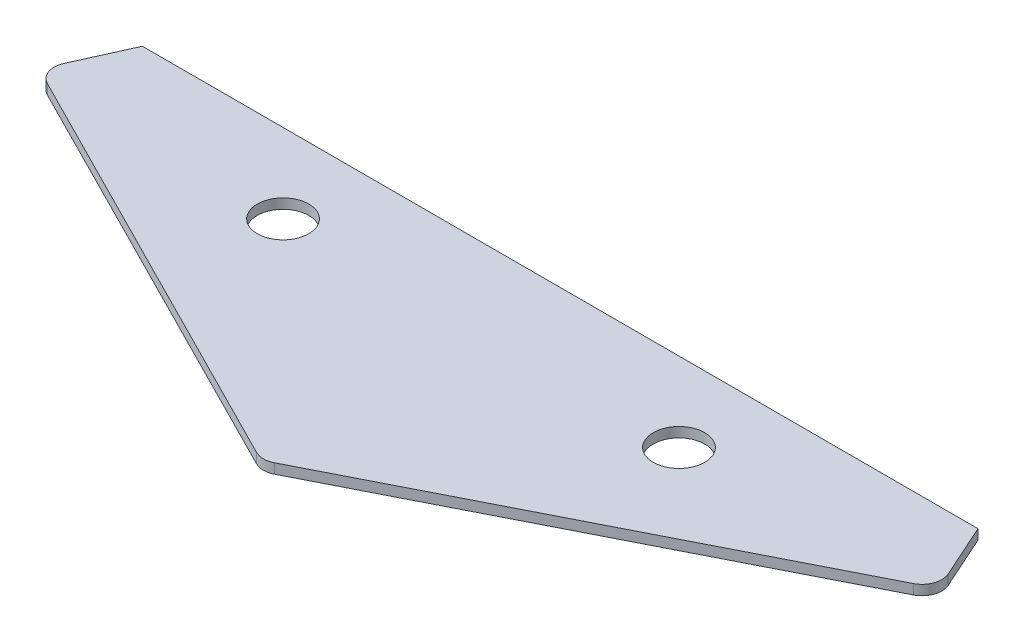
ISO-10303-21;
HEADER;
FILE_DESCRIPTION(('STEP AP214'),'2;1');
FILE_NAME('part.step','',(''),(''),'','','');
FILE_SCHEMA(('AUTOMOTIVE_DESIGN { 1 0 10303 214 1 1 1 1 }'));
ENDSEC;
DATA;
#1=APPLICATION_CONTEXT('core data for automotive mechanical design processes');
#2=APPLICATION_PROTOCOL_DEFINITION('international standard','automotive_design',2000,#1);
#3=PRODUCT_CONTEXT('',#1,'mechanical');
#4=PRODUCT('Part','Part','',(#3));
#5=PRODUCT_RELATED_PRODUCT_CATEGORY('part','',(#4));
#6=PRODUCT_DEFINITION_FORMATION('','',#4);
#7=PRODUCT_DEFINITION_CONTEXT('part definition',#1,'design');
#8=PRODUCT_DEFINITION('design','',#6,#7);
#9=PRODUCT_DEFINITION_SHAPE('','',#8);
#10=(LENGTH_UNIT() NAMED_UNIT(*) SI_UNIT(.MILLI.,.METRE.));
#11=(NAMED_UNIT(*) PLANE_ANGLE_UNIT() SI_UNIT($,.RADIAN.));
#12=(NAMED_UNIT(*) SI_UNIT($,.STERADIAN.) SOLID_ANGLE_UNIT());
#13=UNCERTAINTY_MEASURE_WITH_UNIT(LENGTH_MEASURE(1.E-05),#10,'distance_accuracy_value','');
#14=(GEOMETRIC_REPRESENTATION_CONTEXT(3) GLOBAL_UNCERTAINTY_ASSIGNED_CONTEXT((#13)) GLOBAL_UNIT_ASSIGNED_CONTEXT((#10,
#11,#12)) REPRESENTATION_CONTEXT('',''));
#15=CARTESIAN_POINT('',(0.,0.,0.));
#16=DIRECTION('',(0.,0.,1.));
#17=DIRECTION('',(1.,0.,0.));
#18=AXIS2_PLACEMENT_3D('',#15,#16,#17);
#19=CARTESIAN_POINT('',(-174.030687800207,5.,-52.5933410586918));
#20=DIRECTION('',(0.,0.,1.));
#21=DIRECTION('',(1.,0.,0.));
#22=AXIS2_PLACEMENT_3D('',#19,#20,#21);
#23=PLANE('',#22);
#24=DIRECTION('',(-1.,0.,0.));
#25=VECTOR('',#24,1.);
#26=CARTESIAN_POINT('',(-174.030687800207,0.,-52.5933410586918));
#27=LINE('',#26,#25);
#28=CARTESIAN_POINT('',(248.032931617598,0.,-52.5933410586918));
#29=VERTEX_POINT('',#28);
#30=CARTESIAN_POINT('',(-174.030687800207,0.,-52.5933410586918));
#31=VERTEX_POINT('',#30);
#32=EDGE_CURVE('E129',#29,#31,#27,.T.);
#33=ORIENTED_EDGE('',*,*,#32,.T.);
#34=DIRECTION('',(0.,-1.,0.));
#35=VECTOR('',#34,1.);
#36=CARTESIAN_POINT('',(-174.030687800207,5.,-52.5933410586918));
#37=LINE('',#36,#35);
#38=CARTESIAN_POINT('',(-174.030687800207,5.,-52.5933410586918));
#39=VERTEX_POINT('',#38);
#40=EDGE_CURVE('E11',#39,#31,#37,.T.);
#41=ORIENTED_EDGE('',*,*,#40,.F.);
#42=DIRECTION('',(-1.,0.,0.));
#43=VECTOR('',#42,1.);
#44=CARTESIAN_POINT('',(-174.030687800207,5.,-52.5933410586918));
#45=LINE('',#44,#43);
#46=CARTESIAN_POINT('',(248.032931617598,5.,-52.5933410586918));
#47=VERTEX_POINT('',#46);
#48=EDGE_CURVE('E144',#47,#39,#45,.T.);
#49=ORIENTED_EDGE('',*,*,#48,.F.);
#50=DIRECTION('',(0.,-1.,0.));
#51=VECTOR('',#50,1.);
#52=CARTESIAN_POINT('',(248.032931617598,5.,-52.5933410586918));
#53=LINE('',#52,#51);
#54=EDGE_CURVE('E125',#47,#29,#53,.T.);
#55=ORIENTED_EDGE('',*,*,#54,.T.);
#56=EDGE_LOOP('',(#33,#41,#49,#55));
#57=FACE_BOUND('',#56,.T.);
#58=ADVANCED_FACE('F33',(#57),#23,.F.);
#59=CARTESIAN_POINT('',(-174.030687800207,5.,-52.5933410586918));
#60=DIRECTION('',(0.91215918004391,0.,0.409836101706063));
#61=DIRECTION('',(0.409836101706063,0.,-0.91215918004391));
#62=AXIS2_PLACEMENT_3D('',#59,#60,#61);
#63=PLANE('',#62);
#64=DIRECTION('',(-0.409836101706063,0.,0.91215918004391));
#65=VECTOR('',#64,1.);
#66=CARTESIAN_POINT('',(-174.030687800207,0.,-52.5933410586918));
#67=LINE('',#66,#65);
#68=CARTESIAN_POINT('',(-186.30332408999,0.,-25.2785247004834));
#69=VERTEX_POINT('',#68);
#70=EDGE_CURVE('E132',#31,#69,#67,.T.);
#71=ORIENTED_EDGE('',*,*,#70,.T.);
#72=DIRECTION('',(0.,-1.,0.));
#73=VECTOR('',#72,1.);
#74=CARTESIAN_POINT('',(-186.30332408999,5.,-25.2785247004834));
#75=LINE('',#74,#73);
#76=CARTESIAN_POINT('',(-186.30332408999,5.,-25.2785247004834));
#77=VERTEX_POINT('',#76);
#78=EDGE_CURVE('E41',#77,#69,#75,.T.);
#79=ORIENTED_EDGE('',*,*,#78,.F.);
#80=DIRECTION('',(-0.409836101706063,0.,0.91215918004391));
#81=VECTOR('',#80,1.);
#82=CARTESIAN_POINT('',(-174.030687800207,5.,-52.5933410586918));
#83=LINE('',#82,#81);
#84=EDGE_CURVE('E92',#39,#77,#83,.T.);
#85=ORIENTED_EDGE('',*,*,#84,.F.);
#86=ORIENTED_EDGE('',*,*,#40,.T.);
#87=EDGE_LOOP('',(#71,#79,#85,#86));
#88=FACE_BOUND('',#87,.T.);
#89=ADVANCED_FACE('F213',(#88),#63,.F.);
#90=CARTESIAN_POINT('',(-177.181732289551,5.,-21.1801636834228));
#91=DIRECTION('',(0.,-1.,0.));
#92=DIRECTION('',(0.,0.,-1.));
#93=AXIS2_PLACEMENT_3D('',#90,#91,#92);
#94=CYLINDRICAL_SURFACE('',#93,10.);
#95=CARTESIAN_POINT('',(-177.181732289551,0.,-21.1801636834228));
#96=DIRECTION('',(0.,1.,0.));
#97=DIRECTION('',(0.,0.,1.));
#98=AXIS2_PLACEMENT_3D('',#95,#96,#97);
#99=CIRCLE('',#98,10.);
#100=CARTESIAN_POINT('',(-181.70123706956,0.,-12.2597333942791));
#101=VERTEX_POINT('',#100);
#102=EDGE_CURVE('E135',#69,#101,#99,.T.);
#103=ORIENTED_EDGE('',*,*,#102,.T.);
#104=DIRECTION('',(0.,-1.,0.));
#105=VECTOR('',#104,1.);
#106=CARTESIAN_POINT('',(-181.70123706956,5.,-12.2597333942791));
#107=LINE('',#106,#105);
#108=CARTESIAN_POINT('',(-181.70123706956,5.,-12.2597333942791));
#109=VERTEX_POINT('',#108);
#110=EDGE_CURVE('E151',#109,#101,#107,.T.);
#111=ORIENTED_EDGE('',*,*,#110,.F.);
#112=CARTESIAN_POINT('',(-177.181732289551,5.,-21.1801636834228));
#113=DIRECTION('',(0.,1.,0.));
#114=DIRECTION('',(0.,0.,1.));
#115=AXIS2_PLACEMENT_3D('',#112,#113,#114);
#116=CIRCLE('',#115,10.);
#117=EDGE_CURVE('E159',#77,#109,#116,.T.);
#118=ORIENTED_EDGE('',*,*,#117,.F.);
#119=ORIENTED_EDGE('',*,*,#78,.T.);
#120=EDGE_LOOP('',(#103,#111,#118,#119));
#121=FACE_BOUND('',#120,.T.);
#122=ADVANCED_FACE('F157',(#121),#94,.T.);
#123=CARTESIAN_POINT('',(32.4816171286858,5.,96.255259937727));
#124=DIRECTION('',(0.451950478000949,0.,-0.892043028914365));
#125=DIRECTION('',(-0.892043028914365,0.,-0.451950478000949));
#126=AXIS2_PLACEMENT_3D('',#123,#124,#125);
#127=PLANE('',#126);
#128=DIRECTION('',(0.892043028914365,0.,0.451950478000949));
#129=VECTOR('',#128,1.);
#130=CARTESIAN_POINT('',(32.4816171286858,0.,96.255259937727));
#131=LINE('',#130,#129);
#132=CARTESIAN_POINT('',(32.4816171286858,0.,96.255259937727));
#133=VERTEX_POINT('',#132);
#134=EDGE_CURVE('E137',#101,#133,#131,.T.);
#135=ORIENTED_EDGE('',*,*,#134,.T.);
#136=DIRECTION('',(0.,-1.,0.));
#137=VECTOR('',#136,1.);
#138=CARTESIAN_POINT('',(32.4816171286858,5.,96.255259937727));
#139=LINE('',#138,#137);
#140=CARTESIAN_POINT('',(32.4816171286858,5.,96.255259937727));
#141=VERTEX_POINT('',#140);
#142=EDGE_CURVE('E148',#141,#133,#139,.T.);
#143=ORIENTED_EDGE('',*,*,#142,.F.);
#144=DIRECTION('',(0.892043028914365,0.,0.451950478000949));
#145=VECTOR('',#144,1.);
#146=CARTESIAN_POINT('',(32.4816171286858,5.,96.255259937727));
#147=LINE('',#146,#145);
#148=EDGE_CURVE('E171',#109,#141,#147,.T.);
#149=ORIENTED_EDGE('',*,*,#148,.F.);
#150=ORIENTED_EDGE('',*,*,#110,.T.);
#151=EDGE_LOOP('',(#135,#143,#149,#150));
#152=FACE_BOUND('',#151,.T.);
#153=ADVANCED_FACE('F167',(#152),#127,.F.);
#154=CARTESIAN_POINT('',(37.0011219086953,5.,87.3348296485833));
#155=DIRECTION('',(0.,-1.,0.));
#156=DIRECTION('',(0.,0.,-1.));
#157=AXIS2_PLACEMENT_3D('',#154,#155,#156);
#158=CYLINDRICAL_SURFACE('',#157,10.);
#159=CARTESIAN_POINT('',(37.0011219086953,0.,87.3348296485833));
#160=DIRECTION('',(0.,1.,0.));
#161=DIRECTION('',(0.,0.,1.));
#162=AXIS2_PLACEMENT_3D('',#159,#160,#161);
#163=CIRCLE('',#162,10.);
#164=CARTESIAN_POINT('',(41.5206266887048,0.,96.255259937727));
#165=VERTEX_POINT('',#164);
#166=EDGE_CURVE('E139',#133,#165,#163,.T.);
#167=ORIENTED_EDGE('',*,*,#166,.T.);
#168=DIRECTION('',(0.,-1.,0.));
#169=VECTOR('',#168,1.);
#170=CARTESIAN_POINT('',(41.5206266887048,5.,96.255259937727));
#171=LINE('',#170,#169);
#172=CARTESIAN_POINT('',(41.5206266887048,5.,96.255259937727));
#173=VERTEX_POINT('',#172);
#174=EDGE_CURVE('E120',#173,#165,#171,.T.);
#175=ORIENTED_EDGE('',*,*,#174,.F.);
#176=CARTESIAN_POINT('',(37.0011219086953,5.,87.3348296485833));
#177=DIRECTION('',(0.,1.,0.));
#178=DIRECTION('',(0.,0.,1.));
#179=AXIS2_PLACEMENT_3D('',#176,#177,#178);
#180=CIRCLE('',#179,10.);
#181=EDGE_CURVE('E111',#141,#173,#180,.T.);
#182=ORIENTED_EDGE('',*,*,#181,.F.);
#183=ORIENTED_EDGE('',*,*,#142,.T.);
#184=EDGE_LOOP('',(#167,#175,#182,#183));
#185=FACE_BOUND('',#184,.T.);
#186=ADVANCED_FACE('F170',(#185),#158,.T.);
#187=CARTESIAN_POINT('',(41.5206266887048,5.,96.255259937727));
#188=DIRECTION('',(-0.451950478000949,0.,-0.892043028914365));
#189=DIRECTION('',(-0.892043028914365,0.,0.451950478000949));
#190=AXIS2_PLACEMENT_3D('',#187,#188,#189);
#191=PLANE('',#190);
#192=DIRECTION('',(0.892043028914365,0.,-0.451950478000949));
#193=VECTOR('',#192,1.);
#194=CARTESIAN_POINT('',(41.5206266887048,0.,96.255259937727));
#195=LINE('',#194,#193);
#196=CARTESIAN_POINT('',(255.703480886951,0.,-12.2597333942791));
#197=VERTEX_POINT('',#196);
#198=EDGE_CURVE('E119',#165,#197,#195,.T.);
#199=ORIENTED_EDGE('',*,*,#198,.T.);
#200=DIRECTION('',(0.,-1.,0.));
#201=VECTOR('',#200,1.);
#202=CARTESIAN_POINT('',(255.703480886951,5.,-12.2597333942791));
#203=LINE('',#202,#201);
#204=CARTESIAN_POINT('',(255.703480886951,5.,-12.2597333942791));
#205=VERTEX_POINT('',#204);
#206=EDGE_CURVE('E116',#205,#197,#203,.T.);
#207=ORIENTED_EDGE('',*,*,#206,.F.);
#208=DIRECTION('',(0.892043028914365,0.,-0.451950478000949));
#209=VECTOR('',#208,1.);
#210=CARTESIAN_POINT('',(41.5206266887048,5.,96.255259937727));
#211=LINE('',#210,#209);
#212=EDGE_CURVE('E105',#173,#205,#211,.T.);
#213=ORIENTED_EDGE('',*,*,#212,.F.);
#214=ORIENTED_EDGE('',*,*,#174,.T.);
#215=EDGE_LOOP('',(#199,#207,#213,#214));
#216=FACE_BOUND('',#215,.T.);
#217=ADVANCED_FACE('F117',(#216),#191,.F.);
#218=CARTESIAN_POINT('',(251.183976106941,5.,-21.1801636834228));
#219=DIRECTION('',(0.,-1.,0.));
#220=DIRECTION('',(0.,0.,-1.));
#221=AXIS2_PLACEMENT_3D('',#218,#219,#220);
#222=CYLINDRICAL_SURFACE('',#221,10.);
#223=CARTESIAN_POINT('',(251.183976106941,0.,-21.1801636834228));
#224=DIRECTION('',(0.,1.,0.));
#225=DIRECTION('',(0.,0.,-1.));
#226=AXIS2_PLACEMENT_3D('',#223,#224,#225);
#227=CIRCLE('',#226,10.);
#228=CARTESIAN_POINT('',(260.305567907381,0.,-25.2785247004834));
#229=VERTEX_POINT('',#228);
#230=EDGE_CURVE('E78',#197,#229,#227,.T.);
#231=ORIENTED_EDGE('',*,*,#230,.T.);
#232=DIRECTION('',(0.,-1.,0.));
#233=VECTOR('',#232,1.);
#234=CARTESIAN_POINT('',(260.305567907381,5.,-25.2785247004834));
#235=LINE('',#234,#233);
#236=CARTESIAN_POINT('',(260.305567907381,5.,-25.2785247004834));
#237=VERTEX_POINT('',#236);
#238=EDGE_CURVE('E121',#237,#229,#235,.T.);
#239=ORIENTED_EDGE('',*,*,#238,.F.);
#240=CARTESIAN_POINT('',(251.183976106941,5.,-21.1801636834228));
#241=DIRECTION('',(0.,1.,0.));
#242=DIRECTION('',(0.,0.,-1.));
#243=AXIS2_PLACEMENT_3D('',#240,#241,#242);
#244=CIRCLE('',#243,10.);
#245=EDGE_CURVE('E109',#205,#237,#244,.T.);
#246=ORIENTED_EDGE('',*,*,#245,.F.);
#247=ORIENTED_EDGE('',*,*,#206,.T.);
#248=EDGE_LOOP('',(#231,#239,#246,#247));
#249=FACE_BOUND('',#248,.T.);
#250=ADVANCED_FACE('F123',(#249),#222,.T.);
#251=CARTESIAN_POINT('',(248.032931617598,5.,-52.5933410586918));
#252=DIRECTION('',(-0.912159180043909,0.,0.409836101706064));
#253=DIRECTION('',(0.409836101706064,0.,0.912159180043909));
#254=AXIS2_PLACEMENT_3D('',#251,#252,#253);
#255=PLANE('',#254);
#256=DIRECTION('',(-0.409836101706064,0.,-0.912159180043909));
#257=VECTOR('',#256,1.);
#258=CARTESIAN_POINT('',(248.032931617598,0.,-52.5933410586918));
#259=LINE('',#258,#257);
#260=EDGE_CURVE('E84',#229,#29,#259,.T.);
#261=ORIENTED_EDGE('',*,*,#260,.T.);
#262=ORIENTED_EDGE('',*,*,#54,.F.);
#263=DIRECTION('',(-0.409836101706064,0.,-0.912159180043909));
#264=VECTOR('',#263,1.);
#265=CARTESIAN_POINT('',(248.032931617598,5.,-52.5933410586918));
#266=LINE('',#265,#264);
#267=EDGE_CURVE('E49',#237,#47,#266,.T.);
#268=ORIENTED_EDGE('',*,*,#267,.F.);
#269=ORIENTED_EDGE('',*,*,#238,.T.);
#270=EDGE_LOOP('',(#261,#262,#268,#269));
#271=FACE_BOUND('',#270,.T.);
#272=ADVANCED_FACE('F200',(#271),#255,.F.);
#273=CARTESIAN_POINT('',(251.183976106941,5.,-21.1801636834228));
#274=DIRECTION('',(0.,-1.,0.));
#275=DIRECTION('',(0.,0.,-1.));
#276=AXIS2_PLACEMENT_3D('',#273,#274,#275);
#277=PLANE('',#276);
#278=CARTESIAN_POINT('',(137.001121908695,5.,-12.5933410586918));
#279=DIRECTION('',(0.,1.,0.));
#280=DIRECTION('',(0.,0.,1.));
#281=AXIS2_PLACEMENT_3D('',#278,#279,#280);
#282=CIRCLE('',#281,13.);
#283=CARTESIAN_POINT('',(137.001121908695,5.,0.406658941308249));
#284=VERTEX_POINT('',#283);
#285=EDGE_CURVE('E183',#284,#284,#282,.T.);
#286=ORIENTED_EDGE('',*,*,#285,.F.);
#287=EDGE_LOOP('',(#286));
#288=FACE_BOUND('',#287,.T.);
#289=CARTESIAN_POINT('',(-62.9988780913047,5.,-12.5933410586917));
#290=DIRECTION('',(0.,1.,0.));
#291=DIRECTION('',(0.,0.,1.));
#292=AXIS2_PLACEMENT_3D('',#289,#290,#291);
#293=CIRCLE('',#292,13.);
#294=CARTESIAN_POINT('',(-62.9988780913047,5.,0.406658941308259));
#295=VERTEX_POINT('',#294);
#296=EDGE_CURVE('E177',#295,#295,#293,.T.);
#297=ORIENTED_EDGE('',*,*,#296,.F.);
#298=EDGE_LOOP('',(#297));
#299=FACE_BOUND('',#298,.T.);
#300=ORIENTED_EDGE('',*,*,#48,.T.);
#301=ORIENTED_EDGE('',*,*,#84,.T.);
#302=ORIENTED_EDGE('',*,*,#117,.T.);
#303=ORIENTED_EDGE('',*,*,#148,.T.);
#304=ORIENTED_EDGE('',*,*,#181,.T.);
#305=ORIENTED_EDGE('',*,*,#212,.T.);
#306=ORIENTED_EDGE('',*,*,#245,.T.);
#307=ORIENTED_EDGE('',*,*,#267,.T.);
#308=EDGE_LOOP('',(#300,#301,#302,#303,#304,#305,#306,#307));
#309=FACE_BOUND('',#308,.T.);
#310=ADVANCED_FACE('F107',(#288,#299,#309),#277,.F.);
#311=CARTESIAN_POINT('',(251.183976106941,0.,-21.1801636834228));
#312=DIRECTION('',(0.,-1.,0.));
#313=DIRECTION('',(0.,0.,-1.));
#314=AXIS2_PLACEMENT_3D('',#311,#312,#313);
#315=PLANE('',#314);
#316=CARTESIAN_POINT('',(137.001121908695,0.,-12.5933410586918));
#317=DIRECTION('',(0.,1.,0.));
#318=DIRECTION('',(0.,0.,1.));
#319=AXIS2_PLACEMENT_3D('',#316,#317,#318);
#320=CIRCLE('',#319,13.);
#321=CARTESIAN_POINT('',(137.001121908695,0.,0.406658941308249));
#322=VERTEX_POINT('',#321);
#323=EDGE_CURVE('E133',#322,#322,#320,.T.);
#324=ORIENTED_EDGE('',*,*,#323,.T.);
#325=EDGE_LOOP('',(#324));
#326=FACE_BOUND('',#325,.T.);
#327=CARTESIAN_POINT('',(-62.9988780913047,0.,-12.5933410586917));
#328=DIRECTION('',(0.,1.,0.));
#329=DIRECTION('',(0.,0.,1.));
#330=AXIS2_PLACEMENT_3D('',#327,#328,#329);
#331=CIRCLE('',#330,13.);
#332=CARTESIAN_POINT('',(-62.9988780913047,0.,0.406658941308259));
#333=VERTEX_POINT('',#332);
#334=EDGE_CURVE('E180',#333,#333,#331,.T.);
#335=ORIENTED_EDGE('',*,*,#334,.T.);
#336=EDGE_LOOP('',(#335));
#337=FACE_BOUND('',#336,.T.);
#338=ORIENTED_EDGE('',*,*,#32,.F.);
#339=ORIENTED_EDGE('',*,*,#260,.F.);
#340=ORIENTED_EDGE('',*,*,#230,.F.);
#341=ORIENTED_EDGE('',*,*,#198,.F.);
#342=ORIENTED_EDGE('',*,*,#166,.F.);
#343=ORIENTED_EDGE('',*,*,#134,.F.);
#344=ORIENTED_EDGE('',*,*,#102,.F.);
#345=ORIENTED_EDGE('',*,*,#70,.F.);
#346=EDGE_LOOP('',(#338,#339,#340,#341,#342,#343,#344,#345));
#347=FACE_BOUND('',#346,.T.);
#348=ADVANCED_FACE('F163',(#326,#337,#347),#315,.T.);
#349=CARTESIAN_POINT('',(-62.9988780913047,0.,-12.5933410586917));
#350=DIRECTION('',(0.,1.,0.));
#351=DIRECTION('',(0.,0.,1.));
#352=AXIS2_PLACEMENT_3D('',#349,#350,#351);
#353=CYLINDRICAL_SURFACE('',#352,13.);
#354=ORIENTED_EDGE('',*,*,#334,.F.);
#355=EDGE_LOOP('',(#354));
#356=FACE_BOUND('',#355,.T.);
#357=ORIENTED_EDGE('',*,*,#296,.T.);
#358=EDGE_LOOP('',(#357));
#359=FACE_BOUND('',#358,.T.);
#360=ADVANCED_FACE('F194',(#356,#359),#353,.F.);
#361=CARTESIAN_POINT('',(137.001121908695,0.,-12.5933410586918));
#362=DIRECTION('',(0.,1.,0.));
#363=DIRECTION('',(0.,0.,1.));
#364=AXIS2_PLACEMENT_3D('',#361,#362,#363);
#365=CYLINDRICAL_SURFACE('',#364,13.);
#366=ORIENTED_EDGE('',*,*,#323,.F.);
#367=EDGE_LOOP('',(#366));
#368=FACE_BOUND('',#367,.T.);
#369=ORIENTED_EDGE('',*,*,#285,.T.);
#370=EDGE_LOOP('',(#369));
#371=FACE_BOUND('',#370,.T.);
#372=ADVANCED_FACE('F191',(#368,#371),#365,.F.);
#373=CLOSED_SHELL('',(#58,#89,#122,#153,#186,#217,#250,#272,#310,#348,#360,#372));
#374=MANIFOLD_SOLID_BREP('B2',#373);
#375=ADVANCED_BREP_SHAPE_REPRESENTATION('',(#18,#374),#14);
#376=SHAPE_DEFINITION_REPRESENTATION(#9,#375);
ENDSEC;
END-ISO-10303-21;
